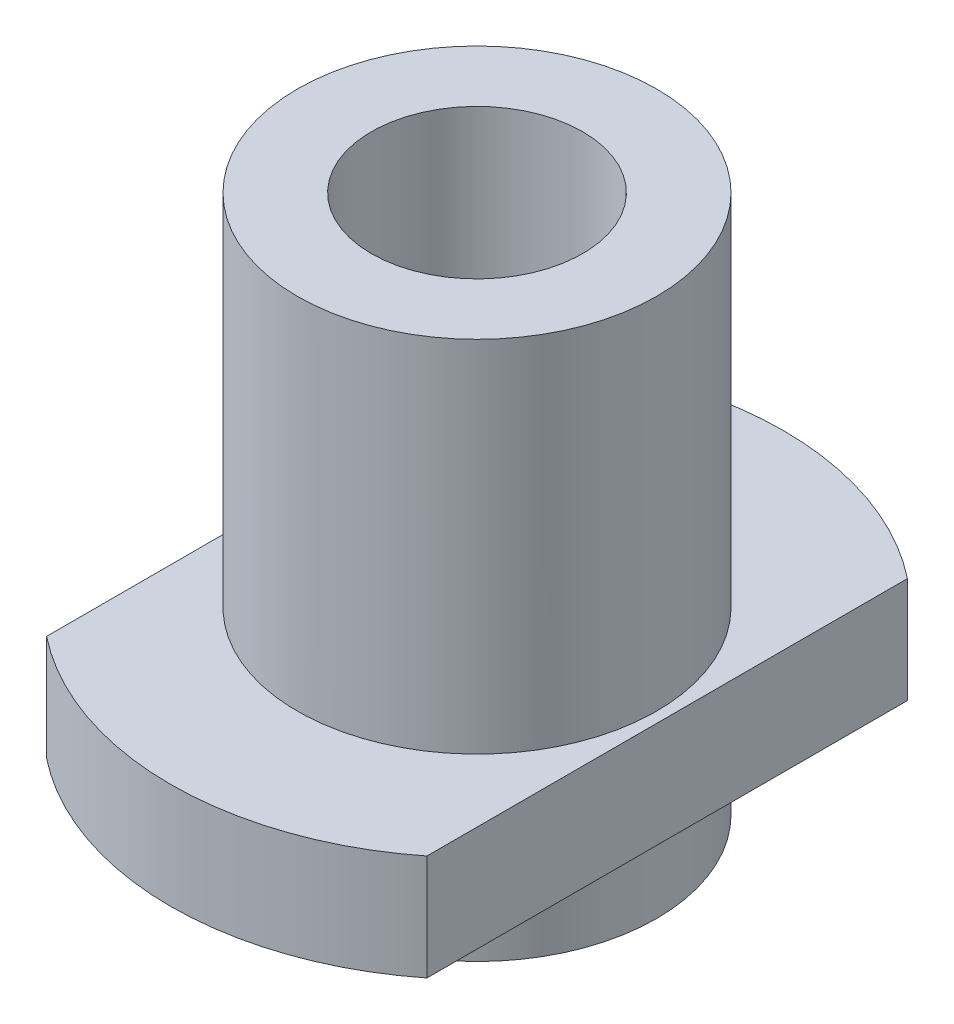
ISO-10303-21;
HEADER;
FILE_DESCRIPTION(('STEP AP214'),'2;1');
FILE_NAME('part.step','',(''),(''),'','','');
FILE_SCHEMA(('AUTOMOTIVE_DESIGN { 1 0 10303 214 1 1 1 1 }'));
ENDSEC;
DATA;
#1=APPLICATION_CONTEXT('core data for automotive mechanical design processes');
#2=APPLICATION_PROTOCOL_DEFINITION('international standard','automotive_design',2000,#1);
#3=PRODUCT_CONTEXT('',#1,'mechanical');
#4=PRODUCT('Part','Part','',(#3));
#5=PRODUCT_RELATED_PRODUCT_CATEGORY('part','',(#4));
#6=PRODUCT_DEFINITION_FORMATION('','',#4);
#7=PRODUCT_DEFINITION_CONTEXT('part definition',#1,'design');
#8=PRODUCT_DEFINITION('design','',#6,#7);
#9=PRODUCT_DEFINITION_SHAPE('','',#8);
#10=(LENGTH_UNIT() NAMED_UNIT(*) SI_UNIT(.MILLI.,.METRE.));
#11=(NAMED_UNIT(*) PLANE_ANGLE_UNIT() SI_UNIT($,.RADIAN.));
#12=(NAMED_UNIT(*) SI_UNIT($,.STERADIAN.) SOLID_ANGLE_UNIT());
#13=UNCERTAINTY_MEASURE_WITH_UNIT(LENGTH_MEASURE(1.E-05),#10,'distance_accuracy_value','');
#14=(GEOMETRIC_REPRESENTATION_CONTEXT(3) GLOBAL_UNCERTAINTY_ASSIGNED_CONTEXT((#13)) GLOBAL_UNIT_ASSIGNED_CONTEXT((#10,
#11,#12)) REPRESENTATION_CONTEXT('',''));
#15=CARTESIAN_POINT('',(0.,0.,0.));
#16=DIRECTION('',(0.,0.,1.));
#17=DIRECTION('',(1.,0.,0.));
#18=AXIS2_PLACEMENT_3D('',#15,#16,#17);
#19=CARTESIAN_POINT('',(0.,51.,0.));
#20=DIRECTION('',(0.,-1.,0.));
#21=DIRECTION('',(0.,0.,-1.));
#22=AXIS2_PLACEMENT_3D('',#19,#20,#21);
#23=CYLINDRICAL_SURFACE('',#22,17.);
#24=CARTESIAN_POINT('',(0.,51.,0.));
#25=DIRECTION('',(0.,1.,0.));
#26=DIRECTION('',(0.,0.,1.));
#27=AXIS2_PLACEMENT_3D('',#24,#25,#26);
#28=CIRCLE('',#27,17.);
#29=CARTESIAN_POINT('',(0.,51.,17.));
#30=VERTEX_POINT('',#29);
#31=EDGE_CURVE('E50',#30,#30,#28,.T.);
#32=ORIENTED_EDGE('',*,*,#31,.F.);
#33=EDGE_LOOP('',(#32));
#34=FACE_BOUND('',#33,.T.);
#35=CARTESIAN_POINT('',(0.,17.,0.));
#36=DIRECTION('',(0.,-1.,0.));
#37=DIRECTION('',(0.,0.,-1.));
#38=AXIS2_PLACEMENT_3D('',#35,#36,#37);
#39=CIRCLE('',#38,17.);
#40=CARTESIAN_POINT('',(0.,17.,-17.));
#41=VERTEX_POINT('',#40);
#42=EDGE_CURVE('E11',#41,#41,#39,.T.);
#43=ORIENTED_EDGE('',*,*,#42,.F.);
#44=EDGE_LOOP('',(#43));
#45=FACE_BOUND('',#44,.T.);
#46=ADVANCED_FACE('F39',(#34,#45),#23,.T.);
#47=CARTESIAN_POINT('',(0.,51.,0.));
#48=DIRECTION('',(0.,1.,0.));
#49=DIRECTION('',(0.,0.,1.));
#50=AXIS2_PLACEMENT_3D('',#47,#48,#49);
#51=PLANE('',#50);
#52=ORIENTED_EDGE('',*,*,#31,.T.);
#53=EDGE_LOOP('',(#52));
#54=FACE_BOUND('',#53,.T.);
#55=CARTESIAN_POINT('',(0.,51.,0.));
#56=DIRECTION('',(0.,1.,0.));
#57=DIRECTION('',(0.,0.,1.));
#58=AXIS2_PLACEMENT_3D('',#55,#56,#57);
#59=CIRCLE('',#58,10.);
#60=CARTESIAN_POINT('',(0.,51.,10.));
#61=VERTEX_POINT('',#60);
#62=EDGE_CURVE('E139',#61,#61,#59,.T.);
#63=ORIENTED_EDGE('',*,*,#62,.F.);
#64=EDGE_LOOP('',(#63));
#65=FACE_BOUND('',#64,.T.);
#66=ADVANCED_FACE('F157',(#54,#65),#51,.T.);
#67=CARTESIAN_POINT('',(0.,0.,0.));
#68=DIRECTION('',(0.,1.,0.));
#69=DIRECTION('',(0.,0.,1.));
#70=AXIS2_PLACEMENT_3D('',#67,#68,#69);
#71=PLANE('',#70);
#72=CARTESIAN_POINT('',(0.,0.,0.));
#73=DIRECTION('',(0.,1.,0.));
#74=DIRECTION('',(0.,0.,1.));
#75=AXIS2_PLACEMENT_3D('',#72,#73,#74);
#76=CIRCLE('',#75,17.);
#77=CARTESIAN_POINT('',(0.,0.,17.));
#78=VERTEX_POINT('',#77);
#79=EDGE_CURVE('E43',#78,#78,#76,.T.);
#80=ORIENTED_EDGE('',*,*,#79,.F.);
#81=EDGE_LOOP('',(#80));
#82=FACE_BOUND('',#81,.T.);
#83=CARTESIAN_POINT('',(0.,0.,0.));
#84=DIRECTION('',(0.,1.,0.));
#85=DIRECTION('',(0.,0.,1.));
#86=AXIS2_PLACEMENT_3D('',#83,#84,#85);
#87=CIRCLE('',#86,10.);
#88=CARTESIAN_POINT('',(0.,0.,10.));
#89=VERTEX_POINT('',#88);
#90=EDGE_CURVE('E137',#89,#89,#87,.T.);
#91=ORIENTED_EDGE('',*,*,#90,.T.);
#92=EDGE_LOOP('',(#91));
#93=FACE_BOUND('',#92,.T.);
#94=ADVANCED_FACE('F154',(#82,#93),#71,.F.);
#95=CARTESIAN_POINT('',(0.,7.,0.));
#96=DIRECTION('',(0.,-1.,0.));
#97=DIRECTION('',(0.,0.,-1.));
#98=AXIS2_PLACEMENT_3D('',#95,#96,#97);
#99=CIRCLE('',#98,17.);
#100=CARTESIAN_POINT('',(0.,7.,-17.));
#101=VERTEX_POINT('',#100);
#102=EDGE_CURVE('E130',#101,#101,#99,.T.);
#103=ORIENTED_EDGE('',*,*,#102,.T.);
#104=EDGE_LOOP('',(#103));
#105=FACE_BOUND('',#104,.T.);
#106=ORIENTED_EDGE('',*,*,#79,.T.);
#107=EDGE_LOOP('',(#106));
#108=FACE_BOUND('',#107,.T.);
#109=ADVANCED_FACE('F41',(#105,#108),#23,.T.);
#110=CARTESIAN_POINT('',(0.,51.,0.));
#111=DIRECTION('',(0.,-1.,0.));
#112=DIRECTION('',(0.,0.,-1.));
#113=AXIS2_PLACEMENT_3D('',#110,#111,#112);
#114=CYLINDRICAL_SURFACE('',#113,10.);
#115=ORIENTED_EDGE('',*,*,#90,.F.);
#116=EDGE_LOOP('',(#115));
#117=FACE_BOUND('',#116,.T.);
#118=ORIENTED_EDGE('',*,*,#62,.T.);
#119=EDGE_LOOP('',(#118));
#120=FACE_BOUND('',#119,.T.);
#121=ADVANCED_FACE('F160',(#117,#120),#114,.F.);
#122=CARTESIAN_POINT('',(0.,17.,0.));
#123=DIRECTION('',(0.,-1.,0.));
#124=DIRECTION('',(0.,0.,-1.));
#125=AXIS2_PLACEMENT_3D('',#122,#123,#124);
#126=PLANE('',#125);
#127=CARTESIAN_POINT('',(0.,17.,0.));
#128=DIRECTION('',(0.,-1.,0.));
#129=DIRECTION('',(0.,0.,-1.));
#130=AXIS2_PLACEMENT_3D('',#127,#128,#129);
#131=CIRCLE('',#130,29.);
#132=CARTESIAN_POINT('',(18.,17.,22.7376340018041));
#133=VERTEX_POINT('',#132);
#134=CARTESIAN_POINT('',(-18.,17.,22.7376340018042));
#135=VERTEX_POINT('',#134);
#136=EDGE_CURVE('E108',#133,#135,#131,.T.);
#137=ORIENTED_EDGE('',*,*,#136,.F.);
#138=DIRECTION('',(0.,0.,1.));
#139=VECTOR('',#138,1.);
#140=CARTESIAN_POINT('',(18.,17.,22.7376340018041));
#141=LINE('',#140,#139);
#142=CARTESIAN_POINT('',(18.,17.,-22.7376340018041));
#143=VERTEX_POINT('',#142);
#144=EDGE_CURVE('E103',#143,#133,#141,.T.);
#145=ORIENTED_EDGE('',*,*,#144,.F.);
#146=CARTESIAN_POINT('',(0.,17.,0.));
#147=DIRECTION('',(0.,-1.,0.));
#148=DIRECTION('',(0.,0.,-1.));
#149=AXIS2_PLACEMENT_3D('',#146,#147,#148);
#150=CIRCLE('',#149,29.);
#151=CARTESIAN_POINT('',(-18.,17.,-22.7376340018042));
#152=VERTEX_POINT('',#151);
#153=EDGE_CURVE('E93',#152,#143,#150,.T.);
#154=ORIENTED_EDGE('',*,*,#153,.F.);
#155=DIRECTION('',(0.,0.,-1.));
#156=VECTOR('',#155,1.);
#157=CARTESIAN_POINT('',(-18.,17.,22.7376340018042));
#158=LINE('',#157,#156);
#159=EDGE_CURVE('E102',#135,#152,#158,.T.);
#160=ORIENTED_EDGE('',*,*,#159,.F.);
#161=EDGE_LOOP('',(#137,#145,#154,#160));
#162=FACE_BOUND('',#161,.T.);
#163=ORIENTED_EDGE('',*,*,#42,.T.);
#164=EDGE_LOOP('',(#163));
#165=FACE_BOUND('',#164,.T.);
#166=ADVANCED_FACE('F100',(#162,#165),#126,.F.);
#167=CARTESIAN_POINT('',(0.,7.,0.));
#168=DIRECTION('',(0.,-1.,0.));
#169=DIRECTION('',(0.,0.,-1.));
#170=AXIS2_PLACEMENT_3D('',#167,#168,#169);
#171=PLANE('',#170);
#172=CARTESIAN_POINT('',(0.,7.,0.));
#173=DIRECTION('',(0.,-1.,0.));
#174=DIRECTION('',(0.,0.,-1.));
#175=AXIS2_PLACEMENT_3D('',#172,#173,#174);
#176=CIRCLE('',#175,29.);
#177=CARTESIAN_POINT('',(18.,7.,22.7376340018041));
#178=VERTEX_POINT('',#177);
#179=CARTESIAN_POINT('',(-18.,7.,22.7376340018042));
#180=VERTEX_POINT('',#179);
#181=EDGE_CURVE('E116',#178,#180,#176,.T.);
#182=ORIENTED_EDGE('',*,*,#181,.T.);
#183=DIRECTION('',(0.,0.,-1.));
#184=VECTOR('',#183,1.);
#185=CARTESIAN_POINT('',(-18.,7.,22.7376340018042));
#186=LINE('',#185,#184);
#187=CARTESIAN_POINT('',(-18.,7.,-22.7376340018042));
#188=VERTEX_POINT('',#187);
#189=EDGE_CURVE('E120',#180,#188,#186,.T.);
#190=ORIENTED_EDGE('',*,*,#189,.T.);
#191=CARTESIAN_POINT('',(0.,7.,0.));
#192=DIRECTION('',(0.,-1.,0.));
#193=DIRECTION('',(0.,0.,-1.));
#194=AXIS2_PLACEMENT_3D('',#191,#192,#193);
#195=CIRCLE('',#194,29.);
#196=CARTESIAN_POINT('',(18.,7.,-22.7376340018041));
#197=VERTEX_POINT('',#196);
#198=EDGE_CURVE('E95',#188,#197,#195,.T.);
#199=ORIENTED_EDGE('',*,*,#198,.T.);
#200=DIRECTION('',(0.,0.,1.));
#201=VECTOR('',#200,1.);
#202=CARTESIAN_POINT('',(18.,7.,22.7376340018041));
#203=LINE('',#202,#201);
#204=EDGE_CURVE('E111',#197,#178,#203,.T.);
#205=ORIENTED_EDGE('',*,*,#204,.T.);
#206=EDGE_LOOP('',(#182,#190,#199,#205));
#207=FACE_BOUND('',#206,.T.);
#208=ORIENTED_EDGE('',*,*,#102,.F.);
#209=EDGE_LOOP('',(#208));
#210=FACE_BOUND('',#209,.T.);
#211=ADVANCED_FACE('F177',(#207,#210),#171,.T.);
#212=CARTESIAN_POINT('',(0.,17.,0.));
#213=DIRECTION('',(0.,-1.,0.));
#214=DIRECTION('',(0.,0.,-1.));
#215=AXIS2_PLACEMENT_3D('',#212,#213,#214);
#216=CYLINDRICAL_SURFACE('',#215,29.);
#217=ORIENTED_EDGE('',*,*,#181,.F.);
#218=DIRECTION('',(0.,-1.,0.));
#219=VECTOR('',#218,1.);
#220=CARTESIAN_POINT('',(18.,17.,22.7376340018041));
#221=LINE('',#220,#219);
#222=EDGE_CURVE('E59',#133,#178,#221,.T.);
#223=ORIENTED_EDGE('',*,*,#222,.F.);
#224=ORIENTED_EDGE('',*,*,#136,.T.);
#225=DIRECTION('',(0.,-1.,0.));
#226=VECTOR('',#225,1.);
#227=CARTESIAN_POINT('',(-18.,17.,22.7376340018042));
#228=LINE('',#227,#226);
#229=EDGE_CURVE('E87',#135,#180,#228,.T.);
#230=ORIENTED_EDGE('',*,*,#229,.T.);
#231=EDGE_LOOP('',(#217,#223,#224,#230));
#232=FACE_BOUND('',#231,.T.);
#233=ADVANCED_FACE('F173',(#232),#216,.T.);
#234=CARTESIAN_POINT('',(18.,17.,22.7376340018041));
#235=DIRECTION('',(1.,0.,0.));
#236=DIRECTION('',(0.,0.,-1.));
#237=AXIS2_PLACEMENT_3D('',#234,#235,#236);
#238=PLANE('',#237);
#239=ORIENTED_EDGE('',*,*,#204,.F.);
#240=DIRECTION('',(0.,-1.,0.));
#241=VECTOR('',#240,1.);
#242=CARTESIAN_POINT('',(18.,17.,-22.7376340018041));
#243=LINE('',#242,#241);
#244=EDGE_CURVE('E76',#143,#197,#243,.T.);
#245=ORIENTED_EDGE('',*,*,#244,.F.);
#246=ORIENTED_EDGE('',*,*,#144,.T.);
#247=ORIENTED_EDGE('',*,*,#222,.T.);
#248=EDGE_LOOP('',(#239,#245,#246,#247));
#249=FACE_BOUND('',#248,.T.);
#250=ADVANCED_FACE('F176',(#249),#238,.T.);
#251=CARTESIAN_POINT('',(0.,17.,0.));
#252=DIRECTION('',(0.,-1.,0.));
#253=DIRECTION('',(0.,0.,-1.));
#254=AXIS2_PLACEMENT_3D('',#251,#252,#253);
#255=CYLINDRICAL_SURFACE('',#254,29.);
#256=ORIENTED_EDGE('',*,*,#198,.F.);
#257=DIRECTION('',(0.,-1.,0.));
#258=VECTOR('',#257,1.);
#259=CARTESIAN_POINT('',(-18.,17.,-22.7376340018042));
#260=LINE('',#259,#258);
#261=EDGE_CURVE('E90',#152,#188,#260,.T.);
#262=ORIENTED_EDGE('',*,*,#261,.F.);
#263=ORIENTED_EDGE('',*,*,#153,.T.);
#264=ORIENTED_EDGE('',*,*,#244,.T.);
#265=EDGE_LOOP('',(#256,#262,#263,#264));
#266=FACE_BOUND('',#265,.T.);
#267=ADVANCED_FACE('F92',(#266),#255,.T.);
#268=CARTESIAN_POINT('',(-18.,17.,22.7376340018042));
#269=DIRECTION('',(-1.,0.,0.));
#270=DIRECTION('',(0.,0.,1.));
#271=AXIS2_PLACEMENT_3D('',#268,#269,#270);
#272=PLANE('',#271);
#273=ORIENTED_EDGE('',*,*,#189,.F.);
#274=ORIENTED_EDGE('',*,*,#229,.F.);
#275=ORIENTED_EDGE('',*,*,#159,.T.);
#276=ORIENTED_EDGE('',*,*,#261,.T.);
#277=EDGE_LOOP('',(#273,#274,#275,#276));
#278=FACE_BOUND('',#277,.T.);
#279=ADVANCED_FACE('F106',(#278),#272,.T.);
#280=CLOSED_SHELL('',(#46,#66,#94,#109,#121,#166,#211,#233,#250,#267,#279));
#281=MANIFOLD_SOLID_BREP('B2',#280);
#282=ADVANCED_BREP_SHAPE_REPRESENTATION('',(#18,#281),#14);
#283=SHAPE_DEFINITION_REPRESENTATION(#9,#282);
ENDSEC;
END-ISO-10303-21;
